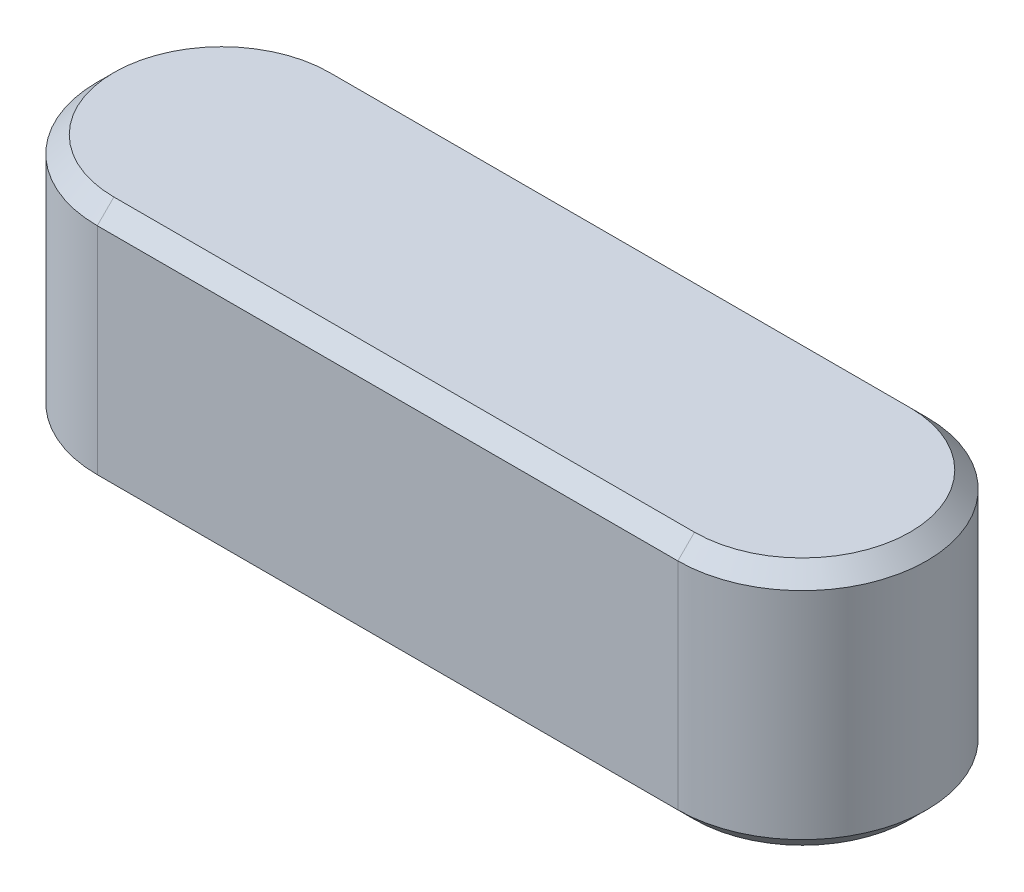
ISO-10303-21;
HEADER;
FILE_DESCRIPTION(('STEP AP214'),'2;1');
FILE_NAME('part.step','',(''),(''),'','','');
FILE_SCHEMA(('AUTOMOTIVE_DESIGN { 1 0 10303 214 1 1 1 1 }'));
ENDSEC;
DATA;
#1=APPLICATION_CONTEXT('core data for automotive mechanical design processes');
#2=APPLICATION_PROTOCOL_DEFINITION('international standard','automotive_design',2000,#1);
#3=PRODUCT_CONTEXT('',#1,'mechanical');
#4=PRODUCT('Part','Part','',(#3));
#5=PRODUCT_RELATED_PRODUCT_CATEGORY('part','',(#4));
#6=PRODUCT_DEFINITION_FORMATION('','',#4);
#7=PRODUCT_DEFINITION_CONTEXT('part definition',#1,'design');
#8=PRODUCT_DEFINITION('design','',#6,#7);
#9=PRODUCT_DEFINITION_SHAPE('','',#8);
#10=(LENGTH_UNIT() NAMED_UNIT(*) SI_UNIT(.MILLI.,.METRE.));
#11=(NAMED_UNIT(*) PLANE_ANGLE_UNIT() SI_UNIT($,.RADIAN.));
#12=(NAMED_UNIT(*) SI_UNIT($,.STERADIAN.) SOLID_ANGLE_UNIT());
#13=UNCERTAINTY_MEASURE_WITH_UNIT(LENGTH_MEASURE(1.E-05),#10,'distance_accuracy_value','');
#14=(GEOMETRIC_REPRESENTATION_CONTEXT(3) GLOBAL_UNCERTAINTY_ASSIGNED_CONTEXT((#13)) GLOBAL_UNIT_ASSIGNED_CONTEXT((#10,
#11,#12)) REPRESENTATION_CONTEXT('',''));
#15=CARTESIAN_POINT('',(0.,0.,0.));
#16=DIRECTION('',(0.,0.,1.));
#17=DIRECTION('',(1.,0.,0.));
#18=AXIS2_PLACEMENT_3D('',#15,#16,#17);
#19=CARTESIAN_POINT('',(3.5,0.,0.));
#20=DIRECTION('',(0.,-1.,0.));
#21=DIRECTION('',(0.,0.,-1.));
#22=AXIS2_PLACEMENT_3D('',#19,#20,#21);
#23=CYLINDRICAL_SURFACE('',#22,1.5);
#24=DIRECTION('',(0.,-1.,0.));
#25=VECTOR('',#24,1.);
#26=CARTESIAN_POINT('',(3.5,3.,1.5));
#27=LINE('',#26,#25);
#28=CARTESIAN_POINT('',(3.5,0.199999999999998,1.5));
#29=VERTEX_POINT('',#28);
#30=CARTESIAN_POINT('',(3.5,2.8,1.5));
#31=VERTEX_POINT('',#30);
#32=EDGE_CURVE('E132',#29,#31,#27,.F.);
#33=ORIENTED_EDGE('',*,*,#32,.F.);
#34=CARTESIAN_POINT('',(3.5,0.199999999999998,0.));
#35=DIRECTION('',(0.,1.,0.));
#36=DIRECTION('',(0.,0.,1.));
#37=AXIS2_PLACEMENT_3D('',#34,#35,#36);
#38=CIRCLE('',#37,1.5);
#39=CARTESIAN_POINT('',(3.5,0.199999999999998,-1.5));
#40=VERTEX_POINT('',#39);
#41=EDGE_CURVE('E117',#29,#40,#38,.T.);
#42=ORIENTED_EDGE('',*,*,#41,.T.);
#43=DIRECTION('',(0.,-1.,0.));
#44=VECTOR('',#43,1.);
#45=CARTESIAN_POINT('',(3.5,3.,-1.5));
#46=LINE('',#45,#44);
#47=CARTESIAN_POINT('',(3.5,2.8,-1.5));
#48=VERTEX_POINT('',#47);
#49=EDGE_CURVE('E125',#48,#40,#46,.T.);
#50=ORIENTED_EDGE('',*,*,#49,.F.);
#51=CARTESIAN_POINT('',(3.5,2.8,0.));
#52=DIRECTION('',(0.,1.,0.));
#53=DIRECTION('',(0.,0.,1.));
#54=AXIS2_PLACEMENT_3D('',#51,#52,#53);
#55=CIRCLE('',#54,1.5);
#56=EDGE_CURVE('E110',#48,#31,#55,.F.);
#57=ORIENTED_EDGE('',*,*,#56,.T.);
#58=EDGE_LOOP('',(#33,#42,#50,#57));
#59=FACE_BOUND('',#58,.T.);
#60=ADVANCED_FACE('F35',(#59),#23,.T.);
#61=CARTESIAN_POINT('',(-3.5,3.,0.));
#62=DIRECTION('',(0.,-1.,0.));
#63=DIRECTION('',(0.,0.,-1.));
#64=AXIS2_PLACEMENT_3D('',#61,#62,#63);
#65=CYLINDRICAL_SURFACE('',#64,1.5);
#66=DIRECTION('',(0.,-1.,0.));
#67=VECTOR('',#66,1.);
#68=CARTESIAN_POINT('',(-3.5,3.,-1.5));
#69=LINE('',#68,#67);
#70=CARTESIAN_POINT('',(-3.5,0.199999999999998,-1.5));
#71=VERTEX_POINT('',#70);
#72=CARTESIAN_POINT('',(-3.5,2.8,-1.5));
#73=VERTEX_POINT('',#72);
#74=EDGE_CURVE('E128',#71,#73,#69,.F.);
#75=ORIENTED_EDGE('',*,*,#74,.F.);
#76=CARTESIAN_POINT('',(-3.5,0.199999999999998,0.));
#77=DIRECTION('',(0.,1.,0.));
#78=DIRECTION('',(0.,0.,1.));
#79=AXIS2_PLACEMENT_3D('',#76,#77,#78);
#80=CIRCLE('',#79,1.5);
#81=CARTESIAN_POINT('',(-3.5,0.199999999999998,1.5));
#82=VERTEX_POINT('',#81);
#83=EDGE_CURVE('E118',#71,#82,#80,.T.);
#84=ORIENTED_EDGE('',*,*,#83,.T.);
#85=DIRECTION('',(0.,-1.,0.));
#86=VECTOR('',#85,1.);
#87=CARTESIAN_POINT('',(-3.5,3.,1.5));
#88=LINE('',#87,#86);
#89=CARTESIAN_POINT('',(-3.5,2.8,1.5));
#90=VERTEX_POINT('',#89);
#91=EDGE_CURVE('E169',#90,#82,#88,.T.);
#92=ORIENTED_EDGE('',*,*,#91,.F.);
#93=CARTESIAN_POINT('',(-3.5,2.8,0.));
#94=DIRECTION('',(0.,1.,0.));
#95=DIRECTION('',(0.,0.,1.));
#96=AXIS2_PLACEMENT_3D('',#93,#94,#95);
#97=CIRCLE('',#96,1.5);
#98=EDGE_CURVE('E147',#90,#73,#97,.F.);
#99=ORIENTED_EDGE('',*,*,#98,.T.);
#100=EDGE_LOOP('',(#75,#84,#92,#99));
#101=FACE_BOUND('',#100,.T.);
#102=ADVANCED_FACE('F192',(#101),#65,.T.);
#103=CARTESIAN_POINT('',(-5.,3.,1.5));
#104=DIRECTION('',(0.,0.,-1.));
#105=DIRECTION('',(-1.,0.,0.));
#106=AXIS2_PLACEMENT_3D('',#103,#104,#105);
#107=PLANE('',#106);
#108=ORIENTED_EDGE('',*,*,#91,.T.);
#109=DIRECTION('',(1.,0.,0.));
#110=VECTOR('',#109,1.);
#111=CARTESIAN_POINT('',(-5.,0.199999999999998,1.5));
#112=LINE('',#111,#110);
#113=EDGE_CURVE('E153',#82,#29,#112,.T.);
#114=ORIENTED_EDGE('',*,*,#113,.T.);
#115=ORIENTED_EDGE('',*,*,#32,.T.);
#116=DIRECTION('',(-1.,0.,0.));
#117=VECTOR('',#116,1.);
#118=CARTESIAN_POINT('',(-3.5,2.8,1.5));
#119=LINE('',#118,#117);
#120=EDGE_CURVE('E151',#31,#90,#119,.T.);
#121=ORIENTED_EDGE('',*,*,#120,.T.);
#122=EDGE_LOOP('',(#108,#114,#115,#121));
#123=FACE_BOUND('',#122,.T.);
#124=ADVANCED_FACE('F189',(#123),#107,.F.);
#125=CARTESIAN_POINT('',(-5.,3.,-1.5));
#126=DIRECTION('',(0.,0.,1.));
#127=DIRECTION('',(1.,0.,0.));
#128=AXIS2_PLACEMENT_3D('',#125,#126,#127);
#129=PLANE('',#128);
#130=ORIENTED_EDGE('',*,*,#49,.T.);
#131=DIRECTION('',(-1.,0.,0.));
#132=VECTOR('',#131,1.);
#133=CARTESIAN_POINT('',(-5.,0.199999999999998,-1.5));
#134=LINE('',#133,#132);
#135=EDGE_CURVE('E129',#40,#71,#134,.T.);
#136=ORIENTED_EDGE('',*,*,#135,.T.);
#137=ORIENTED_EDGE('',*,*,#74,.T.);
#138=DIRECTION('',(1.,0.,0.));
#139=VECTOR('',#138,1.);
#140=CARTESIAN_POINT('',(3.5,2.8,-1.5));
#141=LINE('',#140,#139);
#142=EDGE_CURVE('E105',#73,#48,#141,.T.);
#143=ORIENTED_EDGE('',*,*,#142,.T.);
#144=EDGE_LOOP('',(#130,#136,#137,#143));
#145=FACE_BOUND('',#144,.T.);
#146=ADVANCED_FACE('F123',(#145),#129,.F.);
#147=CARTESIAN_POINT('',(0.,3.,0.));
#148=DIRECTION('',(0.,1.,0.));
#149=DIRECTION('',(0.,0.,1.));
#150=AXIS2_PLACEMENT_3D('',#147,#148,#149);
#151=PLANE('',#150);
#152=CARTESIAN_POINT('',(3.5,3.,0.));
#153=DIRECTION('',(0.,1.,0.));
#154=DIRECTION('',(0.,0.,1.));
#155=AXIS2_PLACEMENT_3D('',#152,#153,#154);
#156=CIRCLE('',#155,1.3);
#157=CARTESIAN_POINT('',(3.5,3.,1.3));
#158=VERTEX_POINT('',#157);
#159=CARTESIAN_POINT('',(3.5,3.,-1.3));
#160=VERTEX_POINT('',#159);
#161=EDGE_CURVE('E59',#158,#160,#156,.T.);
#162=ORIENTED_EDGE('',*,*,#161,.T.);
#163=DIRECTION('',(-1.,0.,0.));
#164=VECTOR('',#163,1.);
#165=CARTESIAN_POINT('',(-3.5,3.,-1.3));
#166=LINE('',#165,#164);
#167=CARTESIAN_POINT('',(-3.5,3.,-1.3));
#168=VERTEX_POINT('',#167);
#169=EDGE_CURVE('E11',#160,#168,#166,.T.);
#170=ORIENTED_EDGE('',*,*,#169,.T.);
#171=CARTESIAN_POINT('',(-3.5,3.,0.));
#172=DIRECTION('',(0.,1.,0.));
#173=DIRECTION('',(0.,0.,1.));
#174=AXIS2_PLACEMENT_3D('',#171,#172,#173);
#175=CIRCLE('',#174,1.3);
#176=CARTESIAN_POINT('',(-3.5,3.,1.3));
#177=VERTEX_POINT('',#176);
#178=EDGE_CURVE('E44',#168,#177,#175,.T.);
#179=ORIENTED_EDGE('',*,*,#178,.T.);
#180=DIRECTION('',(1.,0.,0.));
#181=VECTOR('',#180,1.);
#182=CARTESIAN_POINT('',(3.5,3.,1.3));
#183=LINE('',#182,#181);
#184=EDGE_CURVE('E155',#177,#158,#183,.T.);
#185=ORIENTED_EDGE('',*,*,#184,.T.);
#186=EDGE_LOOP('',(#162,#170,#179,#185));
#187=FACE_BOUND('',#186,.T.);
#188=ADVANCED_FACE('F178',(#187),#151,.T.);
#189=CARTESIAN_POINT('',(0.,0.,0.));
#190=DIRECTION('',(0.,1.,0.));
#191=DIRECTION('',(0.,0.,1.));
#192=AXIS2_PLACEMENT_3D('',#189,#190,#191);
#193=PLANE('',#192);
#194=CARTESIAN_POINT('',(-3.5,0.,0.));
#195=DIRECTION('',(0.,1.,0.));
#196=DIRECTION('',(0.,0.,1.));
#197=AXIS2_PLACEMENT_3D('',#194,#195,#196);
#198=CIRCLE('',#197,1.3);
#199=CARTESIAN_POINT('',(-3.5,0.,1.3));
#200=VERTEX_POINT('',#199);
#201=CARTESIAN_POINT('',(-3.5,0.,-1.3));
#202=VERTEX_POINT('',#201);
#203=EDGE_CURVE('E142',#200,#202,#198,.F.);
#204=ORIENTED_EDGE('',*,*,#203,.T.);
#205=DIRECTION('',(1.,0.,0.));
#206=VECTOR('',#205,1.);
#207=CARTESIAN_POINT('',(0.,0.,-1.3));
#208=LINE('',#207,#206);
#209=CARTESIAN_POINT('',(3.5,0.,-1.3));
#210=VERTEX_POINT('',#209);
#211=EDGE_CURVE('E144',#202,#210,#208,.T.);
#212=ORIENTED_EDGE('',*,*,#211,.T.);
#213=CARTESIAN_POINT('',(3.5,0.,0.));
#214=DIRECTION('',(0.,1.,0.));
#215=DIRECTION('',(0.,0.,1.));
#216=AXIS2_PLACEMENT_3D('',#213,#214,#215);
#217=CIRCLE('',#216,1.3);
#218=CARTESIAN_POINT('',(3.5,0.,1.3));
#219=VERTEX_POINT('',#218);
#220=EDGE_CURVE('E140',#210,#219,#217,.F.);
#221=ORIENTED_EDGE('',*,*,#220,.T.);
#222=DIRECTION('',(-1.,0.,0.));
#223=VECTOR('',#222,1.);
#224=CARTESIAN_POINT('',(0.,0.,1.3));
#225=LINE('',#224,#223);
#226=EDGE_CURVE('E138',#219,#200,#225,.T.);
#227=ORIENTED_EDGE('',*,*,#226,.T.);
#228=EDGE_LOOP('',(#204,#212,#221,#227));
#229=FACE_BOUND('',#228,.T.);
#230=ADVANCED_FACE('F180',(#229),#193,.F.);
#231=CARTESIAN_POINT('',(-5.,0.199999999999998,1.5));
#232=DIRECTION('',(0.,0.707106781186551,-0.707106781186545));
#233=DIRECTION('',(1.,0.,0.));
#234=AXIS2_PLACEMENT_3D('',#231,#232,#233);
#235=PLANE('',#234);
#236=DIRECTION('',(0.,0.707106781186544,0.70710678118655));
#237=VECTOR('',#236,1.);
#238=CARTESIAN_POINT('',(-3.5,0.,1.3));
#239=LINE('',#238,#237);
#240=EDGE_CURVE('E163',#200,#82,#239,.T.);
#241=ORIENTED_EDGE('',*,*,#240,.F.);
#242=ORIENTED_EDGE('',*,*,#226,.F.);
#243=DIRECTION('',(0.,-0.707106781186544,-0.70710678118655));
#244=VECTOR('',#243,1.);
#245=CARTESIAN_POINT('',(3.5,0.199999999999998,1.5));
#246=LINE('',#245,#244);
#247=EDGE_CURVE('E166',#29,#219,#246,.T.);
#248=ORIENTED_EDGE('',*,*,#247,.F.);
#249=ORIENTED_EDGE('',*,*,#113,.F.);
#250=EDGE_LOOP('',(#241,#242,#248,#249));
#251=FACE_BOUND('',#250,.T.);
#252=ADVANCED_FACE('F186',(#251),#235,.F.);
#253=CARTESIAN_POINT('',(3.5,0.,0.));
#254=DIRECTION('',(0.,1.,0.));
#255=DIRECTION('',(0.,0.,1.));
#256=AXIS2_PLACEMENT_3D('',#253,#254,#255);
#257=CONICAL_SURFACE('',#256,1.3,0.785398163397453);
#258=ORIENTED_EDGE('',*,*,#247,.T.);
#259=ORIENTED_EDGE('',*,*,#220,.F.);
#260=DIRECTION('',(0.,-0.707106781186544,0.707106781186551));
#261=VECTOR('',#260,1.);
#262=CARTESIAN_POINT('',(3.5,0.199999999999998,-1.5));
#263=LINE('',#262,#261);
#264=EDGE_CURVE('E161',#40,#210,#263,.T.);
#265=ORIENTED_EDGE('',*,*,#264,.F.);
#266=ORIENTED_EDGE('',*,*,#41,.F.);
#267=EDGE_LOOP('',(#258,#259,#265,#266));
#268=FACE_BOUND('',#267,.T.);
#269=ADVANCED_FACE('F208',(#268),#257,.T.);
#270=CARTESIAN_POINT('',(-3.5,0.,0.));
#271=DIRECTION('',(0.,1.,0.));
#272=DIRECTION('',(0.,0.,1.));
#273=AXIS2_PLACEMENT_3D('',#270,#271,#272);
#274=CONICAL_SURFACE('',#273,1.3,0.785398163397453);
#275=ORIENTED_EDGE('',*,*,#240,.T.);
#276=ORIENTED_EDGE('',*,*,#83,.F.);
#277=DIRECTION('',(0.,0.707106781186544,-0.707106781186551));
#278=VECTOR('',#277,1.);
#279=CARTESIAN_POINT('',(-3.5,0.,-1.3));
#280=LINE('',#279,#278);
#281=EDGE_CURVE('E159',#202,#71,#280,.T.);
#282=ORIENTED_EDGE('',*,*,#281,.F.);
#283=ORIENTED_EDGE('',*,*,#203,.F.);
#284=EDGE_LOOP('',(#275,#276,#282,#283));
#285=FACE_BOUND('',#284,.T.);
#286=ADVANCED_FACE('F204',(#285),#274,.T.);
#287=CARTESIAN_POINT('',(-5.,0.199999999999998,-1.5));
#288=DIRECTION('',(0.,0.707106781186551,0.707106781186545));
#289=DIRECTION('',(-1.,0.,0.));
#290=AXIS2_PLACEMENT_3D('',#287,#288,#289);
#291=PLANE('',#290);
#292=ORIENTED_EDGE('',*,*,#264,.T.);
#293=ORIENTED_EDGE('',*,*,#211,.F.);
#294=ORIENTED_EDGE('',*,*,#281,.T.);
#295=ORIENTED_EDGE('',*,*,#135,.F.);
#296=EDGE_LOOP('',(#292,#293,#294,#295));
#297=FACE_BOUND('',#296,.T.);
#298=ADVANCED_FACE('F201',(#297),#291,.F.);
#299=CARTESIAN_POINT('',(0.,3.,1.3));
#300=DIRECTION('',(0.,0.707106781186548,0.707106781186548));
#301=DIRECTION('',(-1.,0.,0.));
#302=AXIS2_PLACEMENT_3D('',#299,#300,#301);
#303=PLANE('',#302);
#304=DIRECTION('',(0.,0.707106781186548,-0.707106781186548));
#305=VECTOR('',#304,1.);
#306=CARTESIAN_POINT('',(-3.5,2.8,1.5));
#307=LINE('',#306,#305);
#308=EDGE_CURVE('E107',#90,#177,#307,.T.);
#309=ORIENTED_EDGE('',*,*,#308,.F.);
#310=ORIENTED_EDGE('',*,*,#120,.F.);
#311=DIRECTION('',(0.,-0.707106781186548,0.707106781186548));
#312=VECTOR('',#311,1.);
#313=CARTESIAN_POINT('',(3.5,3.,1.3));
#314=LINE('',#313,#312);
#315=EDGE_CURVE('E39',#158,#31,#314,.T.);
#316=ORIENTED_EDGE('',*,*,#315,.F.);
#317=ORIENTED_EDGE('',*,*,#184,.F.);
#318=EDGE_LOOP('',(#309,#310,#316,#317));
#319=FACE_BOUND('',#318,.T.);
#320=ADVANCED_FACE('F37',(#319),#303,.T.);
#321=CARTESIAN_POINT('',(3.5,3.,0.));
#322=DIRECTION('',(0.,-1.,0.));
#323=DIRECTION('',(0.,0.,-1.));
#324=AXIS2_PLACEMENT_3D('',#321,#322,#323);
#325=CONICAL_SURFACE('',#324,1.3,0.785398163397448);
#326=ORIENTED_EDGE('',*,*,#315,.T.);
#327=ORIENTED_EDGE('',*,*,#56,.F.);
#328=DIRECTION('',(0.,-0.707106781186548,-0.707106781186548));
#329=VECTOR('',#328,1.);
#330=CARTESIAN_POINT('',(3.5,3.,-1.3));
#331=LINE('',#330,#329);
#332=EDGE_CURVE('E101',#160,#48,#331,.T.);
#333=ORIENTED_EDGE('',*,*,#332,.F.);
#334=ORIENTED_EDGE('',*,*,#161,.F.);
#335=EDGE_LOOP('',(#326,#327,#333,#334));
#336=FACE_BOUND('',#335,.T.);
#337=ADVANCED_FACE('F111',(#336),#325,.T.);
#338=CARTESIAN_POINT('',(-3.5,3.,0.));
#339=DIRECTION('',(0.,-1.,0.));
#340=DIRECTION('',(0.,0.,-1.));
#341=AXIS2_PLACEMENT_3D('',#338,#339,#340);
#342=CONICAL_SURFACE('',#341,1.3,0.785398163397448);
#343=ORIENTED_EDGE('',*,*,#308,.T.);
#344=ORIENTED_EDGE('',*,*,#178,.F.);
#345=DIRECTION('',(0.,0.707106781186548,0.707106781186548));
#346=VECTOR('',#345,1.);
#347=CARTESIAN_POINT('',(-3.5,2.8,-1.5));
#348=LINE('',#347,#346);
#349=EDGE_CURVE('E52',#73,#168,#348,.T.);
#350=ORIENTED_EDGE('',*,*,#349,.F.);
#351=ORIENTED_EDGE('',*,*,#98,.F.);
#352=EDGE_LOOP('',(#343,#344,#350,#351));
#353=FACE_BOUND('',#352,.T.);
#354=ADVANCED_FACE('F174',(#353),#342,.T.);
#355=CARTESIAN_POINT('',(0.,3.,-1.3));
#356=DIRECTION('',(0.,0.707106781186548,-0.707106781186548));
#357=DIRECTION('',(1.,0.,0.));
#358=AXIS2_PLACEMENT_3D('',#355,#356,#357);
#359=PLANE('',#358);
#360=ORIENTED_EDGE('',*,*,#332,.T.);
#361=ORIENTED_EDGE('',*,*,#142,.F.);
#362=ORIENTED_EDGE('',*,*,#349,.T.);
#363=ORIENTED_EDGE('',*,*,#169,.F.);
#364=EDGE_LOOP('',(#360,#361,#362,#363));
#365=FACE_BOUND('',#364,.T.);
#366=ADVANCED_FACE('F103',(#365),#359,.T.);
#367=CLOSED_SHELL('',(#60,#102,#124,#146,#188,#230,#252,#269,#286,#298,#320,#337,#354,#366));
#368=MANIFOLD_SOLID_BREP('B2',#367);
#369=ADVANCED_BREP_SHAPE_REPRESENTATION('',(#18,#368),#14);
#370=SHAPE_DEFINITION_REPRESENTATION(#9,#369);
ENDSEC;
END-ISO-10303-21;
